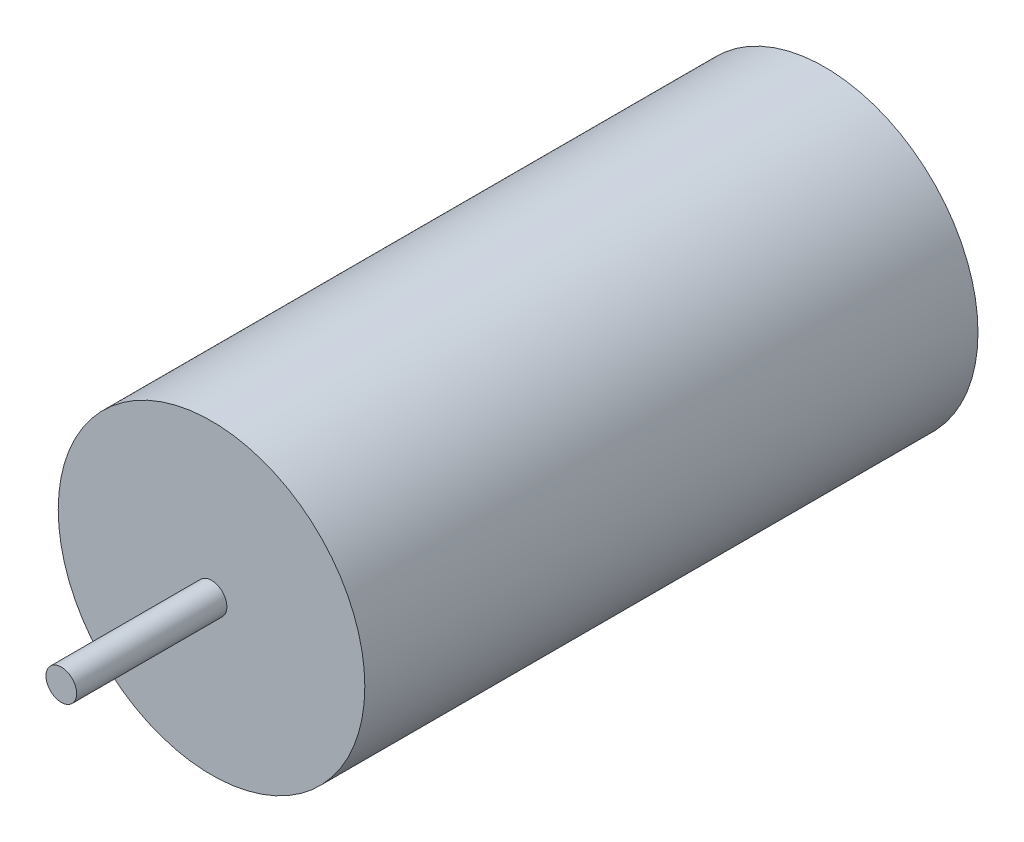
ISO-10303-21;
HEADER;
FILE_DESCRIPTION(('STEP AP214'),'2;1');
FILE_NAME('part.step','',(''),(''),'','','');
FILE_SCHEMA(('AUTOMOTIVE_DESIGN { 1 0 10303 214 1 1 1 1 }'));
ENDSEC;
DATA;
#1=APPLICATION_CONTEXT('core data for automotive mechanical design processes');
#2=APPLICATION_PROTOCOL_DEFINITION('international standard','automotive_design',2000,#1);
#3=PRODUCT_CONTEXT('',#1,'mechanical');
#4=PRODUCT('Part','Part','',(#3));
#5=PRODUCT_RELATED_PRODUCT_CATEGORY('part','',(#4));
#6=PRODUCT_DEFINITION_FORMATION('','',#4);
#7=PRODUCT_DEFINITION_CONTEXT('part definition',#1,'design');
#8=PRODUCT_DEFINITION('design','',#6,#7);
#9=PRODUCT_DEFINITION_SHAPE('','',#8);
#10=(LENGTH_UNIT() NAMED_UNIT(*) SI_UNIT(.MILLI.,.METRE.));
#11=(NAMED_UNIT(*) PLANE_ANGLE_UNIT() SI_UNIT($,.RADIAN.));
#12=(NAMED_UNIT(*) SI_UNIT($,.STERADIAN.) SOLID_ANGLE_UNIT());
#13=UNCERTAINTY_MEASURE_WITH_UNIT(LENGTH_MEASURE(1.E-05),#10,'distance_accuracy_value','');
#14=(GEOMETRIC_REPRESENTATION_CONTEXT(3) GLOBAL_UNCERTAINTY_ASSIGNED_CONTEXT((#13)) GLOBAL_UNIT_ASSIGNED_CONTEXT((#10,
#11,#12)) REPRESENTATION_CONTEXT('',''));
#15=CARTESIAN_POINT('',(0.,0.,0.));
#16=DIRECTION('',(0.,0.,1.));
#17=DIRECTION('',(1.,0.,0.));
#18=AXIS2_PLACEMENT_3D('',#15,#16,#17);
#19=CARTESIAN_POINT('',(0.,0.,40.));
#20=DIRECTION('',(0.,0.,-1.));
#21=DIRECTION('',(-1.,0.,0.));
#22=AXIS2_PLACEMENT_3D('',#19,#20,#21);
#23=CYLINDRICAL_SURFACE('',#22,10.);
#24=CARTESIAN_POINT('',(0.,0.,40.));
#25=DIRECTION('',(0.,0.,1.));
#26=DIRECTION('',(1.,0.,0.));
#27=AXIS2_PLACEMENT_3D('',#24,#25,#26);
#28=CIRCLE('',#27,10.);
#29=CARTESIAN_POINT('',(10.,0.,40.));
#30=VERTEX_POINT('',#29);
#31=EDGE_CURVE('E10',#30,#30,#28,.T.);
#32=ORIENTED_EDGE('',*,*,#31,.F.);
#33=EDGE_LOOP('',(#32));
#34=FACE_BOUND('',#33,.T.);
#35=CARTESIAN_POINT('',(0.,0.,0.));
#36=DIRECTION('',(0.,0.,1.));
#37=DIRECTION('',(1.,0.,0.));
#38=AXIS2_PLACEMENT_3D('',#35,#36,#37);
#39=CIRCLE('',#38,10.);
#40=CARTESIAN_POINT('',(10.,0.,0.));
#41=VERTEX_POINT('',#40);
#42=EDGE_CURVE('E48',#41,#41,#39,.T.);
#43=ORIENTED_EDGE('',*,*,#42,.T.);
#44=EDGE_LOOP('',(#43));
#45=FACE_BOUND('',#44,.T.);
#46=ADVANCED_FACE('F45',(#34,#45),#23,.T.);
#47=CARTESIAN_POINT('',(0.,0.,40.));
#48=DIRECTION('',(0.,0.,1.));
#49=DIRECTION('',(1.,0.,0.));
#50=AXIS2_PLACEMENT_3D('',#47,#48,#49);
#51=PLANE('',#50);
#52=CARTESIAN_POINT('',(0.,0.,40.));
#53=DIRECTION('',(0.,0.,1.));
#54=DIRECTION('',(1.,0.,0.));
#55=AXIS2_PLACEMENT_3D('',#52,#53,#54);
#56=CIRCLE('',#55,1.);
#57=CARTESIAN_POINT('',(1.,0.,40.));
#58=VERTEX_POINT('',#57);
#59=EDGE_CURVE('E57',#58,#58,#56,.T.);
#60=ORIENTED_EDGE('',*,*,#59,.F.);
#61=EDGE_LOOP('',(#60));
#62=FACE_BOUND('',#61,.T.);
#63=ORIENTED_EDGE('',*,*,#31,.T.);
#64=EDGE_LOOP('',(#63));
#65=FACE_BOUND('',#64,.T.);
#66=ADVANCED_FACE('F72',(#62,#65),#51,.T.);
#67=CARTESIAN_POINT('',(0.,0.,0.));
#68=DIRECTION('',(0.,0.,1.));
#69=DIRECTION('',(1.,0.,0.));
#70=AXIS2_PLACEMENT_3D('',#67,#68,#69);
#71=PLANE('',#70);
#72=ORIENTED_EDGE('',*,*,#42,.F.);
#73=EDGE_LOOP('',(#72));
#74=FACE_BOUND('',#73,.T.);
#75=ADVANCED_FACE('F68',(#74),#71,.F.);
#76=CARTESIAN_POINT('',(0.,0.,49.8));
#77=DIRECTION('',(0.,0.,-1.));
#78=DIRECTION('',(-1.,0.,0.));
#79=AXIS2_PLACEMENT_3D('',#76,#77,#78);
#80=CYLINDRICAL_SURFACE('',#79,1.);
#81=CARTESIAN_POINT('',(0.,0.,49.8));
#82=DIRECTION('',(0.,0.,1.));
#83=DIRECTION('',(1.,0.,0.));
#84=AXIS2_PLACEMENT_3D('',#81,#82,#83);
#85=CIRCLE('',#84,1.);
#86=CARTESIAN_POINT('',(1.,0.,49.8));
#87=VERTEX_POINT('',#86);
#88=EDGE_CURVE('E55',#87,#87,#85,.T.);
#89=ORIENTED_EDGE('',*,*,#88,.F.);
#90=EDGE_LOOP('',(#89));
#91=FACE_BOUND('',#90,.T.);
#92=ORIENTED_EDGE('',*,*,#59,.T.);
#93=EDGE_LOOP('',(#92));
#94=FACE_BOUND('',#93,.T.);
#95=ADVANCED_FACE('F65',(#91,#94),#80,.T.);
#96=CARTESIAN_POINT('',(0.,0.,49.8));
#97=DIRECTION('',(0.,0.,1.));
#98=DIRECTION('',(1.,0.,0.));
#99=AXIS2_PLACEMENT_3D('',#96,#97,#98);
#100=PLANE('',#99);
#101=ORIENTED_EDGE('',*,*,#88,.T.);
#102=EDGE_LOOP('',(#101));
#103=FACE_BOUND('',#102,.T.);
#104=ADVANCED_FACE('F63',(#103),#100,.T.);
#105=CLOSED_SHELL('',(#46,#66,#75,#95,#104));
#106=MANIFOLD_SOLID_BREP('B2',#105);
#107=ADVANCED_BREP_SHAPE_REPRESENTATION('',(#18,#106),#14);
#108=SHAPE_DEFINITION_REPRESENTATION(#9,#107);
ENDSEC;
END-ISO-10303-21;
